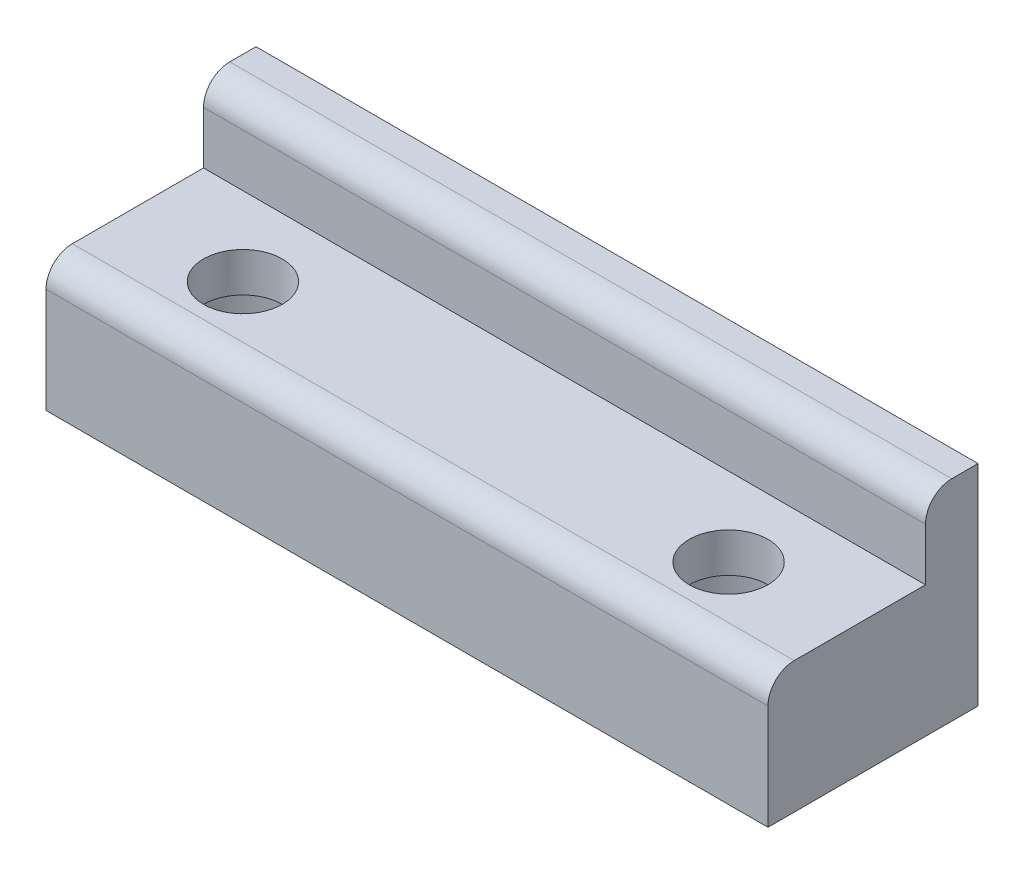
ISO-10303-21;
HEADER;
FILE_DESCRIPTION(('STEP AP214'),'2;1');
FILE_NAME('part.step','',(''),(''),'','','');
FILE_SCHEMA(('AUTOMOTIVE_DESIGN { 1 0 10303 214 1 1 1 1 }'));
ENDSEC;
DATA;
#1=APPLICATION_CONTEXT('core data for automotive mechanical design processes');
#2=APPLICATION_PROTOCOL_DEFINITION('international standard','automotive_design',2000,#1);
#3=PRODUCT_CONTEXT('',#1,'mechanical');
#4=PRODUCT('Part','Part','',(#3));
#5=PRODUCT_RELATED_PRODUCT_CATEGORY('part','',(#4));
#6=PRODUCT_DEFINITION_FORMATION('','',#4);
#7=PRODUCT_DEFINITION_CONTEXT('part definition',#1,'design');
#8=PRODUCT_DEFINITION('design','',#6,#7);
#9=PRODUCT_DEFINITION_SHAPE('','',#8);
#10=(LENGTH_UNIT() NAMED_UNIT(*) SI_UNIT(.MILLI.,.METRE.));
#11=(NAMED_UNIT(*) PLANE_ANGLE_UNIT() SI_UNIT($,.RADIAN.));
#12=(NAMED_UNIT(*) SI_UNIT($,.STERADIAN.) SOLID_ANGLE_UNIT());
#13=UNCERTAINTY_MEASURE_WITH_UNIT(LENGTH_MEASURE(1.E-05),#10,'distance_accuracy_value','');
#14=(GEOMETRIC_REPRESENTATION_CONTEXT(3) GLOBAL_UNCERTAINTY_ASSIGNED_CONTEXT((#13)) GLOBAL_UNIT_ASSIGNED_CONTEXT((#10,
#11,#12)) REPRESENTATION_CONTEXT('',''));
#15=CARTESIAN_POINT('',(0.,0.,0.));
#16=DIRECTION('',(0.,0.,1.));
#17=DIRECTION('',(1.,0.,0.));
#18=AXIS2_PLACEMENT_3D('',#15,#16,#17);
#19=CARTESIAN_POINT('',(23.,0.,-3.));
#20=DIRECTION('',(0.,1.,0.));
#21=DIRECTION('',(0.,0.,1.));
#22=AXIS2_PLACEMENT_3D('',#19,#20,#21);
#23=CYLINDRICAL_SURFACE('',#22,1.5);
#24=CARTESIAN_POINT('',(23.,5.,-3.));
#25=DIRECTION('',(0.,1.,0.));
#26=DIRECTION('',(0.,0.,1.));
#27=AXIS2_PLACEMENT_3D('',#24,#25,#26);
#28=CIRCLE('',#27,1.5);
#29=CARTESIAN_POINT('',(23.,5.,-1.5));
#30=VERTEX_POINT('',#29);
#31=EDGE_CURVE('E159',#30,#30,#28,.T.);
#32=ORIENTED_EDGE('',*,*,#31,.T.);
#33=EDGE_LOOP('',(#32));
#34=FACE_BOUND('',#33,.T.);
#35=CARTESIAN_POINT('',(23.,3.5,-3.));
#36=DIRECTION('',(0.,-1.,0.));
#37=DIRECTION('',(0.,0.,-1.));
#38=AXIS2_PLACEMENT_3D('',#35,#36,#37);
#39=CIRCLE('',#38,1.5);
#40=CARTESIAN_POINT('',(23.,3.5,-4.5));
#41=VERTEX_POINT('',#40);
#42=EDGE_CURVE('E155',#41,#41,#39,.F.);
#43=ORIENTED_EDGE('',*,*,#42,.F.);
#44=EDGE_LOOP('',(#43));
#45=FACE_BOUND('',#44,.T.);
#46=ADVANCED_FACE('F35',(#34,#45),#23,.F.);
#47=CARTESIAN_POINT('',(4.5,0.,-3.));
#48=DIRECTION('',(0.,1.,0.));
#49=DIRECTION('',(0.,0.,1.));
#50=AXIS2_PLACEMENT_3D('',#47,#48,#49);
#51=CYLINDRICAL_SURFACE('',#50,1.5);
#52=CARTESIAN_POINT('',(4.5,5.,-3.));
#53=DIRECTION('',(0.,1.,0.));
#54=DIRECTION('',(0.,0.,1.));
#55=AXIS2_PLACEMENT_3D('',#52,#53,#54);
#56=CIRCLE('',#55,1.5);
#57=CARTESIAN_POINT('',(4.5,5.,-1.5));
#58=VERTEX_POINT('',#57);
#59=EDGE_CURVE('E131',#58,#58,#56,.T.);
#60=ORIENTED_EDGE('',*,*,#59,.T.);
#61=EDGE_LOOP('',(#60));
#62=FACE_BOUND('',#61,.T.);
#63=CARTESIAN_POINT('',(4.5,3.5,-3.));
#64=DIRECTION('',(0.,-1.,0.));
#65=DIRECTION('',(0.,0.,-1.));
#66=AXIS2_PLACEMENT_3D('',#63,#64,#65);
#67=CIRCLE('',#66,1.5);
#68=CARTESIAN_POINT('',(4.5,3.5,-4.5));
#69=VERTEX_POINT('',#68);
#70=EDGE_CURVE('E152',#69,#69,#67,.F.);
#71=ORIENTED_EDGE('',*,*,#70,.F.);
#72=EDGE_LOOP('',(#71));
#73=FACE_BOUND('',#72,.T.);
#74=ADVANCED_FACE('F193',(#62,#73),#51,.F.);
#75=CARTESIAN_POINT('',(0.,5.,0.));
#76=DIRECTION('',(0.,-1.,0.));
#77=DIRECTION('',(0.,0.,-1.));
#78=AXIS2_PLACEMENT_3D('',#75,#76,#77);
#79=PLANE('',#78);
#80=ORIENTED_EDGE('',*,*,#59,.F.);
#81=EDGE_LOOP('',(#80));
#82=FACE_BOUND('',#81,.T.);
#83=ORIENTED_EDGE('',*,*,#31,.F.);
#84=EDGE_LOOP('',(#83));
#85=FACE_BOUND('',#84,.T.);
#86=DIRECTION('',(0.,0.,1.));
#87=VECTOR('',#86,1.);
#88=CARTESIAN_POINT('',(0.,5.,0.));
#89=LINE('',#88,#87);
#90=CARTESIAN_POINT('',(0.,5.,-6.));
#91=VERTEX_POINT('',#90);
#92=CARTESIAN_POINT('',(0.,5.,-1.));
#93=VERTEX_POINT('',#92);
#94=EDGE_CURVE('E135',#91,#93,#89,.T.);
#95=ORIENTED_EDGE('',*,*,#94,.T.);
#96=DIRECTION('',(1.,0.,0.));
#97=VECTOR('',#96,1.);
#98=CARTESIAN_POINT('',(0.,5.,-1.));
#99=LINE('',#98,#97);
#100=CARTESIAN_POINT('',(27.5,5.,-1.));
#101=VERTEX_POINT('',#100);
#102=EDGE_CURVE('E167',#93,#101,#99,.T.);
#103=ORIENTED_EDGE('',*,*,#102,.T.);
#104=DIRECTION('',(0.,0.,-1.));
#105=VECTOR('',#104,1.);
#106=CARTESIAN_POINT('',(27.5,5.,0.));
#107=LINE('',#106,#105);
#108=CARTESIAN_POINT('',(27.5,5.,-6.));
#109=VERTEX_POINT('',#108);
#110=EDGE_CURVE('E138',#101,#109,#107,.T.);
#111=ORIENTED_EDGE('',*,*,#110,.T.);
#112=DIRECTION('',(1.,0.,0.));
#113=VECTOR('',#112,1.);
#114=CARTESIAN_POINT('',(0.,5.,-6.));
#115=LINE('',#114,#113);
#116=EDGE_CURVE('E129',#91,#109,#115,.T.);
#117=ORIENTED_EDGE('',*,*,#116,.F.);
#118=EDGE_LOOP('',(#95,#103,#111,#117));
#119=FACE_BOUND('',#118,.T.);
#120=ADVANCED_FACE('F172',(#82,#85,#119),#79,.F.);
#121=CARTESIAN_POINT('',(0.,5.,0.));
#122=DIRECTION('',(1.,0.,0.));
#123=DIRECTION('',(0.,0.,-1.));
#124=AXIS2_PLACEMENT_3D('',#121,#122,#123);
#125=PLANE('',#124);
#126=DIRECTION('',(0.,-1.,0.));
#127=VECTOR('',#126,1.);
#128=CARTESIAN_POINT('',(0.,5.,0.));
#129=LINE('',#128,#127);
#130=CARTESIAN_POINT('',(0.,4.,0.));
#131=VERTEX_POINT('',#130);
#132=CARTESIAN_POINT('',(0.,0.,0.));
#133=VERTEX_POINT('',#132);
#134=EDGE_CURVE('E150',#131,#133,#129,.T.);
#135=ORIENTED_EDGE('',*,*,#134,.F.);
#136=CARTESIAN_POINT('',(0.,4.,-1.));
#137=DIRECTION('',(1.,0.,0.));
#138=DIRECTION('',(0.,0.,-1.));
#139=AXIS2_PLACEMENT_3D('',#136,#137,#138);
#140=CIRCLE('',#139,1.);
#141=EDGE_CURVE('E11',#131,#93,#140,.F.);
#142=ORIENTED_EDGE('',*,*,#141,.T.);
#143=ORIENTED_EDGE('',*,*,#94,.F.);
#144=DIRECTION('',(0.,-1.,0.));
#145=VECTOR('',#144,1.);
#146=CARTESIAN_POINT('',(0.,8.,-6.));
#147=LINE('',#146,#145);
#148=CARTESIAN_POINT('',(0.,7.,-6.));
#149=VERTEX_POINT('',#148);
#150=EDGE_CURVE('E125',#149,#91,#147,.T.);
#151=ORIENTED_EDGE('',*,*,#150,.F.);
#152=CARTESIAN_POINT('',(0.,7.,-7.));
#153=DIRECTION('',(1.,0.,0.));
#154=DIRECTION('',(0.,0.,-1.));
#155=AXIS2_PLACEMENT_3D('',#152,#153,#154);
#156=CIRCLE('',#155,1.);
#157=CARTESIAN_POINT('',(0.,8.,-7.));
#158=VERTEX_POINT('',#157);
#159=EDGE_CURVE('E165',#149,#158,#156,.F.);
#160=ORIENTED_EDGE('',*,*,#159,.T.);
#161=DIRECTION('',(0.,0.,1.));
#162=VECTOR('',#161,1.);
#163=CARTESIAN_POINT('',(0.,8.,-8.));
#164=LINE('',#163,#162);
#165=CARTESIAN_POINT('',(0.,8.,-8.));
#166=VERTEX_POINT('',#165);
#167=EDGE_CURVE('E108',#166,#158,#164,.T.);
#168=ORIENTED_EDGE('',*,*,#167,.F.);
#169=DIRECTION('',(0.,-1.,0.));
#170=VECTOR('',#169,1.);
#171=CARTESIAN_POINT('',(0.,5.,-8.));
#172=LINE('',#171,#170);
#173=CARTESIAN_POINT('',(0.,0.,-8.));
#174=VERTEX_POINT('',#173);
#175=EDGE_CURVE('E118',#166,#174,#172,.T.);
#176=ORIENTED_EDGE('',*,*,#175,.T.);
#177=DIRECTION('',(0.,0.,1.));
#178=VECTOR('',#177,1.);
#179=CARTESIAN_POINT('',(0.,0.,0.));
#180=LINE('',#179,#178);
#181=EDGE_CURVE('E134',#174,#133,#180,.T.);
#182=ORIENTED_EDGE('',*,*,#181,.T.);
#183=EDGE_LOOP('',(#135,#142,#143,#151,#160,#168,#176,#182));
#184=FACE_BOUND('',#183,.T.);
#185=ADVANCED_FACE('F183',(#184),#125,.F.);
#186=CARTESIAN_POINT('',(0.,5.,0.));
#187=DIRECTION('',(0.,0.,-1.));
#188=DIRECTION('',(-1.,0.,0.));
#189=AXIS2_PLACEMENT_3D('',#186,#187,#188);
#190=PLANE('',#189);
#191=DIRECTION('',(0.,-1.,0.));
#192=VECTOR('',#191,1.);
#193=CARTESIAN_POINT('',(27.5,5.,0.));
#194=LINE('',#193,#192);
#195=CARTESIAN_POINT('',(27.5,4.,0.));
#196=VERTEX_POINT('',#195);
#197=CARTESIAN_POINT('',(27.5,0.,0.));
#198=VERTEX_POINT('',#197);
#199=EDGE_CURVE('E117',#196,#198,#194,.T.);
#200=ORIENTED_EDGE('',*,*,#199,.F.);
#201=DIRECTION('',(1.,0.,0.));
#202=VECTOR('',#201,1.);
#203=CARTESIAN_POINT('',(0.,4.,0.));
#204=LINE('',#203,#202);
#205=EDGE_CURVE('E43',#196,#131,#204,.F.);
#206=ORIENTED_EDGE('',*,*,#205,.T.);
#207=ORIENTED_EDGE('',*,*,#134,.T.);
#208=DIRECTION('',(1.,0.,0.));
#209=VECTOR('',#208,1.);
#210=CARTESIAN_POINT('',(0.,0.,0.));
#211=LINE('',#210,#209);
#212=EDGE_CURVE('E143',#133,#198,#211,.T.);
#213=ORIENTED_EDGE('',*,*,#212,.T.);
#214=EDGE_LOOP('',(#200,#206,#207,#213));
#215=FACE_BOUND('',#214,.T.);
#216=ADVANCED_FACE('F221',(#215),#190,.F.);
#217=CARTESIAN_POINT('',(27.5,5.,0.));
#218=DIRECTION('',(-1.,0.,0.));
#219=DIRECTION('',(0.,0.,1.));
#220=AXIS2_PLACEMENT_3D('',#217,#218,#219);
#221=PLANE('',#220);
#222=ORIENTED_EDGE('',*,*,#110,.F.);
#223=CARTESIAN_POINT('',(27.5,4.,-1.));
#224=DIRECTION('',(-1.,0.,0.));
#225=DIRECTION('',(0.,0.,1.));
#226=AXIS2_PLACEMENT_3D('',#223,#224,#225);
#227=CIRCLE('',#226,1.);
#228=EDGE_CURVE('E57',#101,#196,#227,.F.);
#229=ORIENTED_EDGE('',*,*,#228,.T.);
#230=ORIENTED_EDGE('',*,*,#199,.T.);
#231=DIRECTION('',(0.,0.,-1.));
#232=VECTOR('',#231,1.);
#233=CARTESIAN_POINT('',(27.5,0.,0.));
#234=LINE('',#233,#232);
#235=CARTESIAN_POINT('',(27.5,0.,-8.));
#236=VERTEX_POINT('',#235);
#237=EDGE_CURVE('E114',#198,#236,#234,.T.);
#238=ORIENTED_EDGE('',*,*,#237,.T.);
#239=DIRECTION('',(0.,-1.,0.));
#240=VECTOR('',#239,1.);
#241=CARTESIAN_POINT('',(27.5,5.,-8.));
#242=LINE('',#241,#240);
#243=CARTESIAN_POINT('',(27.5,8.,-8.));
#244=VERTEX_POINT('',#243);
#245=EDGE_CURVE('E111',#244,#236,#242,.T.);
#246=ORIENTED_EDGE('',*,*,#245,.F.);
#247=DIRECTION('',(0.,0.,-1.));
#248=VECTOR('',#247,1.);
#249=CARTESIAN_POINT('',(27.5,8.,-8.));
#250=LINE('',#249,#248);
#251=CARTESIAN_POINT('',(27.5,8.,-7.));
#252=VERTEX_POINT('',#251);
#253=EDGE_CURVE('E99',#252,#244,#250,.T.);
#254=ORIENTED_EDGE('',*,*,#253,.F.);
#255=CARTESIAN_POINT('',(27.5,7.,-7.));
#256=DIRECTION('',(-1.,0.,0.));
#257=DIRECTION('',(0.,0.,1.));
#258=AXIS2_PLACEMENT_3D('',#255,#256,#257);
#259=CIRCLE('',#258,1.);
#260=CARTESIAN_POINT('',(27.5,7.,-6.));
#261=VERTEX_POINT('',#260);
#262=EDGE_CURVE('E161',#252,#261,#259,.F.);
#263=ORIENTED_EDGE('',*,*,#262,.T.);
#264=DIRECTION('',(0.,-1.,0.));
#265=VECTOR('',#264,1.);
#266=CARTESIAN_POINT('',(27.5,8.,-6.));
#267=LINE('',#266,#265);
#268=EDGE_CURVE('E122',#261,#109,#267,.T.);
#269=ORIENTED_EDGE('',*,*,#268,.T.);
#270=EDGE_LOOP('',(#222,#229,#230,#238,#246,#254,#263,#269));
#271=FACE_BOUND('',#270,.T.);
#272=ADVANCED_FACE('F112',(#271),#221,.F.);
#273=CARTESIAN_POINT('',(0.,5.,-8.));
#274=DIRECTION('',(0.,0.,1.));
#275=DIRECTION('',(1.,0.,0.));
#276=AXIS2_PLACEMENT_3D('',#273,#274,#275);
#277=PLANE('',#276);
#278=DIRECTION('',(-1.,0.,0.));
#279=VECTOR('',#278,1.);
#280=CARTESIAN_POINT('',(0.,0.,-8.));
#281=LINE('',#280,#279);
#282=EDGE_CURVE('E139',#236,#174,#281,.T.);
#283=ORIENTED_EDGE('',*,*,#282,.T.);
#284=ORIENTED_EDGE('',*,*,#175,.F.);
#285=DIRECTION('',(-1.,0.,0.));
#286=VECTOR('',#285,1.);
#287=CARTESIAN_POINT('',(0.,8.,-8.));
#288=LINE('',#287,#286);
#289=EDGE_CURVE('E104',#244,#166,#288,.T.);
#290=ORIENTED_EDGE('',*,*,#289,.F.);
#291=ORIENTED_EDGE('',*,*,#245,.T.);
#292=EDGE_LOOP('',(#283,#284,#290,#291));
#293=FACE_BOUND('',#292,.T.);
#294=ADVANCED_FACE('F120',(#293),#277,.F.);
#295=CARTESIAN_POINT('',(0.,0.,0.));
#296=DIRECTION('',(0.,-1.,0.));
#297=DIRECTION('',(0.,0.,-1.));
#298=AXIS2_PLACEMENT_3D('',#295,#296,#297);
#299=PLANE('',#298);
#300=CARTESIAN_POINT('',(4.5,0.,-3.));
#301=DIRECTION('',(0.,-1.,0.));
#302=DIRECTION('',(0.,0.,-1.));
#303=AXIS2_PLACEMENT_3D('',#300,#301,#302);
#304=CIRCLE('',#303,2.95);
#305=CARTESIAN_POINT('',(4.5,0.,-5.95));
#306=VERTEX_POINT('',#305);
#307=EDGE_CURVE('E348',#306,#306,#304,.T.);
#308=ORIENTED_EDGE('',*,*,#307,.F.);
#309=EDGE_LOOP('',(#308));
#310=FACE_BOUND('',#309,.T.);
#311=CARTESIAN_POINT('',(23.,0.,-3.));
#312=DIRECTION('',(0.,-1.,0.));
#313=DIRECTION('',(0.,0.,-1.));
#314=AXIS2_PLACEMENT_3D('',#311,#312,#313);
#315=CIRCLE('',#314,2.95);
#316=CARTESIAN_POINT('',(23.,0.,-5.95));
#317=VERTEX_POINT('',#316);
#318=EDGE_CURVE('E345',#317,#317,#315,.T.);
#319=ORIENTED_EDGE('',*,*,#318,.F.);
#320=EDGE_LOOP('',(#319));
#321=FACE_BOUND('',#320,.T.);
#322=ORIENTED_EDGE('',*,*,#181,.F.);
#323=ORIENTED_EDGE('',*,*,#282,.F.);
#324=ORIENTED_EDGE('',*,*,#237,.F.);
#325=ORIENTED_EDGE('',*,*,#212,.F.);
#326=EDGE_LOOP('',(#322,#323,#324,#325));
#327=FACE_BOUND('',#326,.T.);
#328=ADVANCED_FACE('F210',(#310,#321,#327),#299,.T.);
#329=CARTESIAN_POINT('',(0.,8.,-6.));
#330=DIRECTION('',(0.,0.,-1.));
#331=DIRECTION('',(-1.,0.,0.));
#332=AXIS2_PLACEMENT_3D('',#329,#330,#331);
#333=PLANE('',#332);
#334=ORIENTED_EDGE('',*,*,#268,.F.);
#335=DIRECTION('',(1.,0.,0.));
#336=VECTOR('',#335,1.);
#337=CARTESIAN_POINT('',(0.,7.,-6.));
#338=LINE('',#337,#336);
#339=EDGE_CURVE('E163',#261,#149,#338,.F.);
#340=ORIENTED_EDGE('',*,*,#339,.T.);
#341=ORIENTED_EDGE('',*,*,#150,.T.);
#342=ORIENTED_EDGE('',*,*,#116,.T.);
#343=EDGE_LOOP('',(#334,#340,#341,#342));
#344=FACE_BOUND('',#343,.T.);
#345=ADVANCED_FACE('F180',(#344),#333,.F.);
#346=CARTESIAN_POINT('',(0.,8.,0.));
#347=DIRECTION('',(0.,1.,0.));
#348=DIRECTION('',(0.,0.,1.));
#349=AXIS2_PLACEMENT_3D('',#346,#347,#348);
#350=PLANE('',#349);
#351=ORIENTED_EDGE('',*,*,#167,.T.);
#352=DIRECTION('',(1.,0.,0.));
#353=VECTOR('',#352,1.);
#354=CARTESIAN_POINT('',(27.5,8.,-7.));
#355=LINE('',#354,#353);
#356=EDGE_CURVE('E107',#158,#252,#355,.T.);
#357=ORIENTED_EDGE('',*,*,#356,.T.);
#358=ORIENTED_EDGE('',*,*,#253,.T.);
#359=ORIENTED_EDGE('',*,*,#289,.T.);
#360=EDGE_LOOP('',(#351,#357,#358,#359));
#361=FACE_BOUND('',#360,.T.);
#362=ADVANCED_FACE('F102',(#361),#350,.T.);
#363=CARTESIAN_POINT('',(4.5,3.5,-3.));
#364=DIRECTION('',(0.,-1.,0.));
#365=DIRECTION('',(0.,0.,-1.));
#366=AXIS2_PLACEMENT_3D('',#363,#364,#365);
#367=PLANE('',#366);
#368=CARTESIAN_POINT('',(4.5,3.5,-3.));
#369=DIRECTION('',(0.,-1.,0.));
#370=DIRECTION('',(0.,0.,-1.));
#371=AXIS2_PLACEMENT_3D('',#368,#369,#370);
#372=CIRCLE('',#371,2.95);
#373=CARTESIAN_POINT('',(4.5,3.5,-5.95));
#374=VERTEX_POINT('',#373);
#375=EDGE_CURVE('E156',#374,#374,#372,.T.);
#376=ORIENTED_EDGE('',*,*,#375,.T.);
#377=EDGE_LOOP('',(#376));
#378=FACE_BOUND('',#377,.T.);
#379=ORIENTED_EDGE('',*,*,#70,.T.);
#380=EDGE_LOOP('',(#379));
#381=FACE_BOUND('',#380,.T.);
#382=ADVANCED_FACE('F207',(#378,#381),#367,.T.);
#383=CARTESIAN_POINT('',(4.5,3.5,-3.));
#384=DIRECTION('',(0.,-1.,0.));
#385=DIRECTION('',(0.,0.,-1.));
#386=AXIS2_PLACEMENT_3D('',#383,#384,#385);
#387=CYLINDRICAL_SURFACE('',#386,2.95);
#388=ORIENTED_EDGE('',*,*,#375,.F.);
#389=EDGE_LOOP('',(#388));
#390=FACE_BOUND('',#389,.T.);
#391=ORIENTED_EDGE('',*,*,#307,.T.);
#392=EDGE_LOOP('',(#391));
#393=FACE_BOUND('',#392,.T.);
#394=ADVANCED_FACE('F262',(#390,#393),#387,.F.);
#395=CARTESIAN_POINT('',(23.,3.5,-3.));
#396=DIRECTION('',(0.,-1.,0.));
#397=DIRECTION('',(0.,0.,-1.));
#398=AXIS2_PLACEMENT_3D('',#395,#396,#397);
#399=PLANE('',#398);
#400=CARTESIAN_POINT('',(23.,3.5,-3.));
#401=DIRECTION('',(0.,-1.,0.));
#402=DIRECTION('',(0.,0.,-1.));
#403=AXIS2_PLACEMENT_3D('',#400,#401,#402);
#404=CIRCLE('',#403,2.95);
#405=CARTESIAN_POINT('',(23.,3.5,-5.95));
#406=VERTEX_POINT('',#405);
#407=EDGE_CURVE('E342',#406,#406,#404,.T.);
#408=ORIENTED_EDGE('',*,*,#407,.T.);
#409=EDGE_LOOP('',(#408));
#410=FACE_BOUND('',#409,.T.);
#411=ORIENTED_EDGE('',*,*,#42,.T.);
#412=EDGE_LOOP('',(#411));
#413=FACE_BOUND('',#412,.T.);
#414=ADVANCED_FACE('F270',(#410,#413),#399,.T.);
#415=CARTESIAN_POINT('',(23.,3.5,-3.));
#416=DIRECTION('',(0.,-1.,0.));
#417=DIRECTION('',(0.,0.,-1.));
#418=AXIS2_PLACEMENT_3D('',#415,#416,#417);
#419=CYLINDRICAL_SURFACE('',#418,2.95);
#420=ORIENTED_EDGE('',*,*,#407,.F.);
#421=EDGE_LOOP('',(#420));
#422=FACE_BOUND('',#421,.T.);
#423=ORIENTED_EDGE('',*,*,#318,.T.);
#424=EDGE_LOOP('',(#423));
#425=FACE_BOUND('',#424,.T.);
#426=ADVANCED_FACE('F190',(#422,#425),#419,.F.);
#427=CARTESIAN_POINT('',(0.,7.,-7.));
#428=DIRECTION('',(-1.,0.,0.));
#429=DIRECTION('',(0.,0.,1.));
#430=AXIS2_PLACEMENT_3D('',#427,#428,#429);
#431=CYLINDRICAL_SURFACE('',#430,1.);
#432=ORIENTED_EDGE('',*,*,#159,.F.);
#433=ORIENTED_EDGE('',*,*,#339,.F.);
#434=ORIENTED_EDGE('',*,*,#262,.F.);
#435=ORIENTED_EDGE('',*,*,#356,.F.);
#436=EDGE_LOOP('',(#432,#433,#434,#435));
#437=FACE_BOUND('',#436,.T.);
#438=ADVANCED_FACE('F186',(#437),#431,.T.);
#439=CARTESIAN_POINT('',(0.,4.,-1.));
#440=DIRECTION('',(1.,0.,0.));
#441=DIRECTION('',(0.,0.,-1.));
#442=AXIS2_PLACEMENT_3D('',#439,#440,#441);
#443=CYLINDRICAL_SURFACE('',#442,1.);
#444=ORIENTED_EDGE('',*,*,#141,.F.);
#445=ORIENTED_EDGE('',*,*,#205,.F.);
#446=ORIENTED_EDGE('',*,*,#228,.F.);
#447=ORIENTED_EDGE('',*,*,#102,.F.);
#448=EDGE_LOOP('',(#444,#445,#446,#447));
#449=FACE_BOUND('',#448,.T.);
#450=ADVANCED_FACE('F37',(#449),#443,.T.);
#451=CLOSED_SHELL('',(#46,#74,#120,#185,#216,#272,#294,#328,#345,#362,#382,#394,#414,#426,#438,#450));
#452=MANIFOLD_SOLID_BREP('B2',#451);
#453=ADVANCED_BREP_SHAPE_REPRESENTATION('',(#18,#452),#14);
#454=SHAPE_DEFINITION_REPRESENTATION(#9,#453);
ENDSEC;
END-ISO-10303-21;
